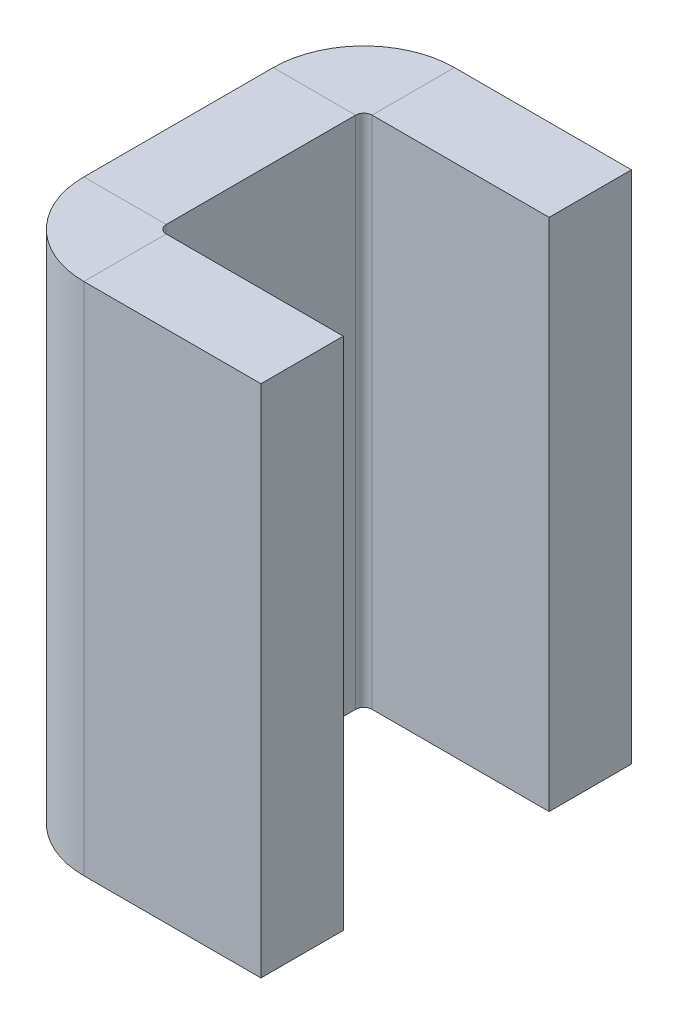
ISO-10303-21;
HEADER;
FILE_DESCRIPTION(('STEP AP214'),'2;1');
FILE_NAME('part.step','',(''),(''),'','','');
FILE_SCHEMA(('AUTOMOTIVE_DESIGN { 1 0 10303 214 1 1 1 1 }'));
ENDSEC;
DATA;
#1=APPLICATION_CONTEXT('core data for automotive mechanical design processes');
#2=APPLICATION_PROTOCOL_DEFINITION('international standard','automotive_design',2000,#1);
#3=PRODUCT_CONTEXT('',#1,'mechanical');
#4=PRODUCT('Part','Part','',(#3));
#5=PRODUCT_RELATED_PRODUCT_CATEGORY('part','',(#4));
#6=PRODUCT_DEFINITION_FORMATION('','',#4);
#7=PRODUCT_DEFINITION_CONTEXT('part definition',#1,'design');
#8=PRODUCT_DEFINITION('design','',#6,#7);
#9=PRODUCT_DEFINITION_SHAPE('','',#8);
#10=(LENGTH_UNIT() NAMED_UNIT(*) SI_UNIT(.MILLI.,.METRE.));
#11=(NAMED_UNIT(*) PLANE_ANGLE_UNIT() SI_UNIT($,.RADIAN.));
#12=(NAMED_UNIT(*) SI_UNIT($,.STERADIAN.) SOLID_ANGLE_UNIT());
#13=UNCERTAINTY_MEASURE_WITH_UNIT(LENGTH_MEASURE(1.E-05),#10,'distance_accuracy_value','');
#14=(GEOMETRIC_REPRESENTATION_CONTEXT(3) GLOBAL_UNCERTAINTY_ASSIGNED_CONTEXT((#13)) GLOBAL_UNIT_ASSIGNED_CONTEXT((#10,
#11,#12)) REPRESENTATION_CONTEXT('',''));
#15=CARTESIAN_POINT('',(0.,0.,0.));
#16=DIRECTION('',(0.,0.,1.));
#17=DIRECTION('',(1.,0.,0.));
#18=AXIS2_PLACEMENT_3D('',#15,#16,#17);
#19=CARTESIAN_POINT('',(38.41388431458,10.585158910602,-1.819325573247));
#20=DIRECTION('',(-1.,8.74227765734797E-08,0.));
#21=DIRECTION('',(0.,0.,1.));
#22=AXIS2_PLACEMENT_3D('',#19,#20,#21);
#23=PLANE('',#22);
#24=DIRECTION('',(-8.74227765734793E-08,-1.,-8.74227339409093E-08));
#25=VECTOR('',#24,1.);
#26=CARTESIAN_POINT('',(38.41388431458,10.585158910602,-1.819325573247));
#27=LINE('',#26,#25);
#28=CARTESIAN_POINT('',(38.413884423858,11.835158910602,-1.819325463969));
#29=VERTEX_POINT('',#28);
#30=CARTESIAN_POINT('',(38.41388431458,10.585158910602,-1.819325573247));
#31=VERTEX_POINT('',#30);
#32=EDGE_CURVE('E296',#29,#31,#27,.T.);
#33=ORIENTED_EDGE('',*,*,#32,.F.);
#34=DIRECTION('',(0.,8.74227339409097E-08,-1.));
#35=VECTOR('',#34,1.);
#36=CARTESIAN_POINT('',(38.413884423858,11.835158910602,-1.819325463969));
#37=LINE('',#36,#35);
#38=CARTESIAN_POINT('',(38.413884423858,11.835158893117,-1.619325463969));
#39=VERTEX_POINT('',#38);
#40=EDGE_CURVE('E11',#39,#29,#37,.T.);
#41=ORIENTED_EDGE('',*,*,#40,.F.);
#42=DIRECTION('',(8.74227765734793E-08,1.,8.74227339409093E-08));
#43=VECTOR('',#42,1.);
#44=CARTESIAN_POINT('',(38.413884423858,11.835158893117,-1.619325463969));
#45=LINE('',#44,#43);
#46=CARTESIAN_POINT('',(38.41388431458,10.585158893117,-1.619325573247));
#47=VERTEX_POINT('',#46);
#48=EDGE_CURVE('E235',#47,#39,#45,.T.);
#49=ORIENTED_EDGE('',*,*,#48,.F.);
#50=DIRECTION('',(0.,-8.74227339409097E-08,1.));
#51=VECTOR('',#50,1.);
#52=CARTESIAN_POINT('',(38.41388431458,10.585158893117,-1.619325573247));
#53=LINE('',#52,#51);
#54=EDGE_CURVE('E190',#31,#47,#53,.T.);
#55=ORIENTED_EDGE('',*,*,#54,.F.);
#56=EDGE_LOOP('',(#33,#41,#49,#55));
#57=FACE_BOUND('',#56,.T.);
#58=ADVANCED_FACE('F16',(#57),#23,.F.);
#59=CARTESIAN_POINT('',(37.983884423858,11.835158948193,-1.819325463969));
#60=DIRECTION('',(-8.74227765734793E-08,-1.,-8.74227339409093E-08));
#61=DIRECTION('',(-1.,8.74227765734797E-08,0.));
#62=AXIS2_PLACEMENT_3D('',#59,#60,#61);
#63=PLANE('',#62);
#64=ORIENTED_EDGE('',*,*,#40,.T.);
#65=DIRECTION('',(1.,-8.74227765734797E-08,0.));
#66=VECTOR('',#65,1.);
#67=CARTESIAN_POINT('',(37.983884423858,11.835158948193,-1.819325463969));
#68=LINE('',#67,#66);
#69=CARTESIAN_POINT('',(37.983884423858,11.835158948193,-1.819325463969));
#70=VERTEX_POINT('',#69);
#71=EDGE_CURVE('E247',#70,#29,#68,.T.);
#72=ORIENTED_EDGE('',*,*,#71,.F.);
#73=DIRECTION('',(0.,8.74227339409097E-08,-1.));
#74=VECTOR('',#73,1.);
#75=CARTESIAN_POINT('',(37.983884423858,11.835158948193,-1.819325463969));
#76=LINE('',#75,#74);
#77=CARTESIAN_POINT('',(37.983884423858,11.835158930709,-1.619325463969));
#78=VERTEX_POINT('',#77);
#79=EDGE_CURVE('E27',#78,#70,#76,.T.);
#80=ORIENTED_EDGE('',*,*,#79,.F.);
#81=DIRECTION('',(1.,-8.74227765734797E-08,0.));
#82=VECTOR('',#81,1.);
#83=CARTESIAN_POINT('',(37.983884423858,11.835158930709,-1.619325463969));
#84=LINE('',#83,#82);
#85=EDGE_CURVE('E254',#78,#39,#84,.T.);
#86=ORIENTED_EDGE('',*,*,#85,.T.);
#87=EDGE_LOOP('',(#64,#72,#80,#86));
#88=FACE_BOUND('',#87,.T.);
#89=ADVANCED_FACE('F18',(#88),#63,.F.);
#90=CARTESIAN_POINT('',(37.899031610116,11.835158949942,-1.754472650227));
#91=DIRECTION('',(8.74227765734793E-08,1.,8.74227339409093E-08));
#92=DIRECTION('',(0.707106608772724,0.,-0.707106953600329));
#93=AXIS2_PLACEMENT_3D('',#90,#91,#92);
#94=PLANE('',#93);
#95=CARTESIAN_POINT('',(37.983884423858,11.835158949942,-1.839325463969));
#96=DIRECTION('',(8.74227765734793E-08,1.,8.74227339409093E-08));
#97=DIRECTION('',(0.,8.74227339409097E-08,-1.));
#98=AXIS2_PLACEMENT_3D('',#95,#96,#97);
#99=CIRCLE('',#98,0.22);
#100=CARTESIAN_POINT('',(37.763884423858,11.835158969175,-1.839325463969));
#101=VERTEX_POINT('',#100);
#102=EDGE_CURVE('E215',#101,#78,#99,.T.);
#103=ORIENTED_EDGE('',*,*,#102,.T.);
#104=ORIENTED_EDGE('',*,*,#79,.T.);
#105=CARTESIAN_POINT('',(37.983884423858,11.835158949942,-1.839325463969));
#106=DIRECTION('',(8.74227765734793E-08,1.,8.74227339409093E-08));
#107=DIRECTION('',(0.,8.74227339409097E-08,-1.));
#108=AXIS2_PLACEMENT_3D('',#105,#106,#107);
#109=CIRCLE('',#108,0.02);
#110=CARTESIAN_POINT('',(37.963884423858,11.83515895169,-1.839325463969));
#111=VERTEX_POINT('',#110);
#112=EDGE_CURVE('E209',#111,#70,#109,.T.);
#113=ORIENTED_EDGE('',*,*,#112,.F.);
#114=DIRECTION('',(1.,-8.74227765734797E-08,0.));
#115=VECTOR('',#114,1.);
#116=CARTESIAN_POINT('',(37.963884423858,11.83515895169,-1.839325463969));
#117=LINE('',#116,#115);
#118=EDGE_CURVE('E126',#101,#111,#117,.T.);
#119=ORIENTED_EDGE('',*,*,#118,.F.);
#120=EDGE_LOOP('',(#103,#104,#113,#119));
#121=FACE_BOUND('',#120,.T.);
#122=ADVANCED_FACE('F452',(#121),#94,.T.);
#123=CARTESIAN_POINT('',(37.963884423858,11.835158991905,-2.299325463969));
#124=DIRECTION('',(-8.74227765734793E-08,-1.,-8.74227339409093E-08));
#125=DIRECTION('',(-1.,8.74227765734797E-08,0.));
#126=AXIS2_PLACEMENT_3D('',#123,#124,#125);
#127=PLANE('',#126);
#128=ORIENTED_EDGE('',*,*,#118,.T.);
#129=DIRECTION('',(0.,-8.74227339409097E-08,1.));
#130=VECTOR('',#129,1.);
#131=CARTESIAN_POINT('',(37.963884423858,11.835158991905,-2.299325463969));
#132=LINE('',#131,#130);
#133=CARTESIAN_POINT('',(37.963884423858,11.835158991905,-2.299325463969));
#134=VERTEX_POINT('',#133);
#135=EDGE_CURVE('E129',#134,#111,#132,.T.);
#136=ORIENTED_EDGE('',*,*,#135,.F.);
#137=DIRECTION('',(1.,-8.74227765734797E-08,0.));
#138=VECTOR('',#137,1.);
#139=CARTESIAN_POINT('',(37.963884423858,11.835158991905,-2.299325463969));
#140=LINE('',#139,#138);
#141=CARTESIAN_POINT('',(37.763884423858,11.835159009389,-2.299325463969));
#142=VERTEX_POINT('',#141);
#143=EDGE_CURVE('E113',#142,#134,#140,.T.);
#144=ORIENTED_EDGE('',*,*,#143,.F.);
#145=DIRECTION('',(0.,-8.74227339409097E-08,1.));
#146=VECTOR('',#145,1.);
#147=CARTESIAN_POINT('',(37.763884423858,11.835159009389,-2.299325463969));
#148=LINE('',#147,#146);
#149=EDGE_CURVE('E180',#142,#101,#148,.T.);
#150=ORIENTED_EDGE('',*,*,#149,.T.);
#151=EDGE_LOOP('',(#128,#136,#144,#150));
#152=FACE_BOUND('',#151,.T.);
#153=ADVANCED_FACE('F130',(#152),#127,.F.);
#154=CARTESIAN_POINT('',(37.899031610116,11.835159004992,-2.384178277711));
#155=DIRECTION('',(8.74227765734793E-08,1.,8.74227339409093E-08));
#156=DIRECTION('',(0.707106608772724,0.,-0.707106953600329));
#157=AXIS2_PLACEMENT_3D('',#154,#155,#156);
#158=PLANE('',#157);
#159=CARTESIAN_POINT('',(37.983884423858,11.835158990156,-2.299325463969));
#160=DIRECTION('',(8.74227765734793E-08,1.,8.74227339409093E-08));
#161=DIRECTION('',(0.,8.74227339409097E-08,-1.));
#162=AXIS2_PLACEMENT_3D('',#159,#160,#161);
#163=CIRCLE('',#162,0.22);
#164=CARTESIAN_POINT('',(37.983884423858,11.835159009389,-2.519325463969));
#165=VERTEX_POINT('',#164);
#166=EDGE_CURVE('E120',#165,#142,#163,.T.);
#167=ORIENTED_EDGE('',*,*,#166,.T.);
#168=ORIENTED_EDGE('',*,*,#143,.T.);
#169=CARTESIAN_POINT('',(37.983884423858,11.835158990156,-2.299325463969));
#170=DIRECTION('',(8.74227765734793E-08,1.,8.74227339409093E-08));
#171=DIRECTION('',(0.,8.74227339409097E-08,-1.));
#172=AXIS2_PLACEMENT_3D('',#169,#170,#171);
#173=CIRCLE('',#172,0.02);
#174=CARTESIAN_POINT('',(37.983884423858,11.835158991905,-2.319325463969));
#175=VERTEX_POINT('',#174);
#176=EDGE_CURVE('E117',#175,#134,#173,.T.);
#177=ORIENTED_EDGE('',*,*,#176,.F.);
#178=DIRECTION('',(0.,-8.74227339409097E-08,1.));
#179=VECTOR('',#178,1.);
#180=CARTESIAN_POINT('',(37.983884423858,11.835158991905,-2.319325463969));
#181=LINE('',#180,#179);
#182=EDGE_CURVE('E20',#165,#175,#181,.T.);
#183=ORIENTED_EDGE('',*,*,#182,.F.);
#184=EDGE_LOOP('',(#167,#168,#177,#183));
#185=FACE_BOUND('',#184,.T.);
#186=ADVANCED_FACE('F115',(#185),#158,.T.);
#187=CARTESIAN_POINT('',(38.413884423858,11.835158954313,-2.319325463969));
#188=DIRECTION('',(-8.74227765734793E-08,-1.,-8.74227339409093E-08));
#189=DIRECTION('',(-1.,8.74227765734797E-08,0.));
#190=AXIS2_PLACEMENT_3D('',#187,#188,#189);
#191=PLANE('',#190);
#192=ORIENTED_EDGE('',*,*,#182,.T.);
#193=DIRECTION('',(-1.,8.74227765734797E-08,0.));
#194=VECTOR('',#193,1.);
#195=CARTESIAN_POINT('',(38.413884423858,11.835158954313,-2.319325463969));
#196=LINE('',#195,#194);
#197=CARTESIAN_POINT('',(38.413884423858,11.835158954313,-2.319325463969));
#198=VERTEX_POINT('',#197);
#199=EDGE_CURVE('E158',#198,#175,#196,.T.);
#200=ORIENTED_EDGE('',*,*,#199,.F.);
#201=DIRECTION('',(0.,-8.74227339409097E-08,1.));
#202=VECTOR('',#201,1.);
#203=CARTESIAN_POINT('',(38.413884423858,11.835158954313,-2.319325463969));
#204=LINE('',#203,#202);
#205=CARTESIAN_POINT('',(38.413884423858,11.835158971797,-2.519325463969));
#206=VERTEX_POINT('',#205);
#207=EDGE_CURVE('E176',#206,#198,#204,.T.);
#208=ORIENTED_EDGE('',*,*,#207,.F.);
#209=DIRECTION('',(-1.,8.74227765734797E-08,0.));
#210=VECTOR('',#209,1.);
#211=CARTESIAN_POINT('',(38.413884423858,11.835158971797,-2.519325463969));
#212=LINE('',#211,#210);
#213=EDGE_CURVE('E246',#206,#165,#212,.T.);
#214=ORIENTED_EDGE('',*,*,#213,.T.);
#215=EDGE_LOOP('',(#192,#200,#208,#214));
#216=FACE_BOUND('',#215,.T.);
#217=ADVANCED_FACE('F280',(#216),#191,.F.);
#218=CARTESIAN_POINT('',(37.983884423858,11.835158930709,-1.619325463969));
#219=DIRECTION('',(0.,8.74227339409097E-08,-1.));
#220=DIRECTION('',(-1.,0.,0.));
#221=AXIS2_PLACEMENT_3D('',#218,#219,#220);
#222=PLANE('',#221);
#223=ORIENTED_EDGE('',*,*,#48,.T.);
#224=ORIENTED_EDGE('',*,*,#85,.F.);
#225=DIRECTION('',(8.74227765734793E-08,1.,8.74227339409093E-08));
#226=VECTOR('',#225,1.);
#227=CARTESIAN_POINT('',(37.983884423858,11.835158930709,-1.619325463969));
#228=LINE('',#227,#226);
#229=CARTESIAN_POINT('',(37.98388431458,10.585158930709,-1.619325573247));
#230=VERTEX_POINT('',#229);
#231=EDGE_CURVE('E212',#230,#78,#228,.T.);
#232=ORIENTED_EDGE('',*,*,#231,.F.);
#233=DIRECTION('',(1.,-8.74227765734797E-08,0.));
#234=VECTOR('',#233,1.);
#235=CARTESIAN_POINT('',(37.98388431458,10.585158930709,-1.619325573247));
#236=LINE('',#235,#234);
#237=EDGE_CURVE('E185',#230,#47,#236,.T.);
#238=ORIENTED_EDGE('',*,*,#237,.T.);
#239=EDGE_LOOP('',(#223,#224,#232,#238));
#240=FACE_BOUND('',#239,.T.);
#241=ADVANCED_FACE('F425',(#240),#222,.F.);
#242=CARTESIAN_POINT('',(37.983884423858,11.835158949942,-1.839325463969));
#243=DIRECTION('',(8.74227765734793E-08,1.,8.74227339409093E-08));
#244=DIRECTION('',(0.,8.74227339409097E-08,-1.));
#245=AXIS2_PLACEMENT_3D('',#242,#243,#244);
#246=CYLINDRICAL_SURFACE('',#245,0.22);
#247=CARTESIAN_POINT('',(37.98388431458,10.585158949942,-1.839325573247));
#248=DIRECTION('',(8.74227765734793E-08,1.,8.74227339409093E-08));
#249=DIRECTION('',(0.,8.74227339409097E-08,-1.));
#250=AXIS2_PLACEMENT_3D('',#247,#248,#249);
#251=CIRCLE('',#250,0.22);
#252=CARTESIAN_POINT('',(37.76388431458,10.585158969175,-1.839325573247));
#253=VERTEX_POINT('',#252);
#254=EDGE_CURVE('E219',#253,#230,#251,.T.);
#255=ORIENTED_EDGE('',*,*,#254,.T.);
#256=ORIENTED_EDGE('',*,*,#231,.T.);
#257=ORIENTED_EDGE('',*,*,#102,.F.);
#258=DIRECTION('',(8.74227765734793E-08,1.,8.74227339409093E-08));
#259=VECTOR('',#258,1.);
#260=CARTESIAN_POINT('',(37.763884423858,11.835158969175,-1.839325463969));
#261=LINE('',#260,#259);
#262=EDGE_CURVE('E177',#253,#101,#261,.T.);
#263=ORIENTED_EDGE('',*,*,#262,.F.);
#264=EDGE_LOOP('',(#255,#256,#257,#263));
#265=FACE_BOUND('',#264,.T.);
#266=ADVANCED_FACE('F466',(#265),#246,.T.);
#267=CARTESIAN_POINT('',(37.763884423858,11.835159009389,-2.299325463969));
#268=DIRECTION('',(1.,-8.74227765734797E-08,0.));
#269=DIRECTION('',(0.,8.74227377816483E-08,-1.));
#270=AXIS2_PLACEMENT_3D('',#267,#268,#269);
#271=PLANE('',#270);
#272=ORIENTED_EDGE('',*,*,#262,.T.);
#273=ORIENTED_EDGE('',*,*,#149,.F.);
#274=DIRECTION('',(8.74227765734793E-08,1.,8.74227339409093E-08));
#275=VECTOR('',#274,1.);
#276=CARTESIAN_POINT('',(37.763884423858,11.835159009389,-2.299325463969));
#277=LINE('',#276,#275);
#278=CARTESIAN_POINT('',(37.76388431458,10.585159009389,-2.299325573247));
#279=VERTEX_POINT('',#278);
#280=EDGE_CURVE('E243',#279,#142,#277,.T.);
#281=ORIENTED_EDGE('',*,*,#280,.F.);
#282=DIRECTION('',(0.,-8.74227339409097E-08,1.));
#283=VECTOR('',#282,1.);
#284=CARTESIAN_POINT('',(37.76388431458,10.585159009389,-2.299325573247));
#285=LINE('',#284,#283);
#286=EDGE_CURVE('E269',#279,#253,#285,.T.);
#287=ORIENTED_EDGE('',*,*,#286,.T.);
#288=EDGE_LOOP('',(#272,#273,#281,#287));
#289=FACE_BOUND('',#288,.T.);
#290=ADVANCED_FACE('F413',(#289),#271,.F.);
#291=CARTESIAN_POINT('',(37.983884423858,11.835158990156,-2.299325463969));
#292=DIRECTION('',(8.74227765734793E-08,1.,8.74227339409093E-08));
#293=DIRECTION('',(0.,8.74227339409097E-08,-1.));
#294=AXIS2_PLACEMENT_3D('',#291,#292,#293);
#295=CYLINDRICAL_SURFACE('',#294,0.22);
#296=CARTESIAN_POINT('',(37.98388431458,10.585158990156,-2.299325573247));
#297=DIRECTION('',(8.74227765734793E-08,1.,8.74227339409093E-08));
#298=DIRECTION('',(0.,8.74227339409097E-08,-1.));
#299=AXIS2_PLACEMENT_3D('',#296,#297,#298);
#300=CIRCLE('',#299,0.22);
#301=CARTESIAN_POINT('',(37.98388431458,10.585159009389,-2.519325573247));
#302=VERTEX_POINT('',#301);
#303=EDGE_CURVE('E203',#302,#279,#300,.T.);
#304=ORIENTED_EDGE('',*,*,#303,.T.);
#305=ORIENTED_EDGE('',*,*,#280,.T.);
#306=ORIENTED_EDGE('',*,*,#166,.F.);
#307=DIRECTION('',(8.74227765734793E-08,1.,8.74227339409093E-08));
#308=VECTOR('',#307,1.);
#309=CARTESIAN_POINT('',(37.983884423858,11.835159009389,-2.519325463969));
#310=LINE('',#309,#308);
#311=EDGE_CURVE('E189',#302,#165,#310,.T.);
#312=ORIENTED_EDGE('',*,*,#311,.F.);
#313=EDGE_LOOP('',(#304,#305,#306,#312));
#314=FACE_BOUND('',#313,.T.);
#315=ADVANCED_FACE('F283',(#314),#295,.T.);
#316=CARTESIAN_POINT('',(38.413884423858,11.835158971797,-2.519325463969));
#317=DIRECTION('',(0.,-8.74227339409097E-08,1.));
#318=DIRECTION('',(-1.,0.,0.));
#319=AXIS2_PLACEMENT_3D('',#316,#317,#318);
#320=PLANE('',#319);
#321=ORIENTED_EDGE('',*,*,#311,.T.);
#322=ORIENTED_EDGE('',*,*,#213,.F.);
#323=DIRECTION('',(8.74227765734793E-08,1.,8.74227339409093E-08));
#324=VECTOR('',#323,1.);
#325=CARTESIAN_POINT('',(38.413884423858,11.835158971797,-2.519325463969));
#326=LINE('',#325,#324);
#327=CARTESIAN_POINT('',(38.41388431458,10.585158971797,-2.519325573247));
#328=VERTEX_POINT('',#327);
#329=EDGE_CURVE('E170',#328,#206,#326,.T.);
#330=ORIENTED_EDGE('',*,*,#329,.F.);
#331=DIRECTION('',(-1.,8.74227765734797E-08,0.));
#332=VECTOR('',#331,1.);
#333=CARTESIAN_POINT('',(38.41388431458,10.585158971797,-2.519325573247));
#334=LINE('',#333,#332);
#335=EDGE_CURVE('E204',#328,#302,#334,.T.);
#336=ORIENTED_EDGE('',*,*,#335,.T.);
#337=EDGE_LOOP('',(#321,#322,#330,#336));
#338=FACE_BOUND('',#337,.T.);
#339=ADVANCED_FACE('F412',(#338),#320,.F.);
#340=CARTESIAN_POINT('',(37.98388431458,10.585158930709,-1.619325573247));
#341=DIRECTION('',(8.74227765734793E-08,1.,8.74227339409093E-08));
#342=DIRECTION('',(0.707106608772724,0.,-0.707106953600329));
#343=AXIS2_PLACEMENT_3D('',#340,#341,#342);
#344=PLANE('',#343);
#345=ORIENTED_EDGE('',*,*,#54,.T.);
#346=ORIENTED_EDGE('',*,*,#237,.F.);
#347=DIRECTION('',(0.,-8.74227339409097E-08,1.));
#348=VECTOR('',#347,1.);
#349=CARTESIAN_POINT('',(37.98388431458,10.585158930709,-1.619325573247));
#350=LINE('',#349,#348);
#351=CARTESIAN_POINT('',(37.98388431458,10.585158948193,-1.819325573247));
#352=VERTEX_POINT('',#351);
#353=EDGE_CURVE('E223',#352,#230,#350,.T.);
#354=ORIENTED_EDGE('',*,*,#353,.F.);
#355=DIRECTION('',(1.,-8.74227765734797E-08,0.));
#356=VECTOR('',#355,1.);
#357=CARTESIAN_POINT('',(37.98388431458,10.585158948193,-1.819325573247));
#358=LINE('',#357,#356);
#359=EDGE_CURVE('E251',#352,#31,#358,.T.);
#360=ORIENTED_EDGE('',*,*,#359,.T.);
#361=EDGE_LOOP('',(#345,#346,#354,#360));
#362=FACE_BOUND('',#361,.T.);
#363=ADVANCED_FACE('F510',(#362),#344,.F.);
#364=CARTESIAN_POINT('',(37.899031500838,10.585158949942,-1.754472759505));
#365=DIRECTION('',(-8.74227765734793E-08,-1.,-8.74227339409093E-08));
#366=DIRECTION('',(-1.,8.74227765734797E-08,0.));
#367=AXIS2_PLACEMENT_3D('',#364,#365,#366);
#368=PLANE('',#367);
#369=CARTESIAN_POINT('',(37.98388431458,10.585158949942,-1.839325573247));
#370=DIRECTION('',(8.74227765734793E-08,1.,8.74227339409093E-08));
#371=DIRECTION('',(0.,8.74227339409097E-08,-1.));
#372=AXIS2_PLACEMENT_3D('',#369,#370,#371);
#373=CIRCLE('',#372,0.02);
#374=CARTESIAN_POINT('',(37.96388431458,10.58515895169,-1.839325573247));
#375=VERTEX_POINT('',#374);
#376=EDGE_CURVE('E205',#375,#352,#373,.T.);
#377=ORIENTED_EDGE('',*,*,#376,.T.);
#378=ORIENTED_EDGE('',*,*,#353,.T.);
#379=ORIENTED_EDGE('',*,*,#254,.F.);
#380=DIRECTION('',(-1.,8.74227765734797E-08,0.));
#381=VECTOR('',#380,1.);
#382=CARTESIAN_POINT('',(37.76388431458,10.585158969175,-1.839325573247));
#383=LINE('',#382,#381);
#384=EDGE_CURVE('E231',#375,#253,#383,.T.);
#385=ORIENTED_EDGE('',*,*,#384,.F.);
#386=EDGE_LOOP('',(#377,#378,#379,#385));
#387=FACE_BOUND('',#386,.T.);
#388=ADVANCED_FACE('F319',(#387),#368,.T.);
#389=CARTESIAN_POINT('',(37.76388431458,10.585159009389,-2.299325573247));
#390=DIRECTION('',(8.74227765734793E-08,1.,8.74227339409093E-08));
#391=DIRECTION('',(0.707106608772724,0.,-0.707106953600329));
#392=AXIS2_PLACEMENT_3D('',#389,#390,#391);
#393=PLANE('',#392);
#394=ORIENTED_EDGE('',*,*,#384,.T.);
#395=ORIENTED_EDGE('',*,*,#286,.F.);
#396=DIRECTION('',(-1.,8.74227765734797E-08,0.));
#397=VECTOR('',#396,1.);
#398=CARTESIAN_POINT('',(37.76388431458,10.585159009389,-2.299325573247));
#399=LINE('',#398,#397);
#400=CARTESIAN_POINT('',(37.96388431458,10.585158991905,-2.299325573247));
#401=VERTEX_POINT('',#400);
#402=EDGE_CURVE('E199',#401,#279,#399,.T.);
#403=ORIENTED_EDGE('',*,*,#402,.F.);
#404=DIRECTION('',(0.,-8.74227339409097E-08,1.));
#405=VECTOR('',#404,1.);
#406=CARTESIAN_POINT('',(37.96388431458,10.585158991905,-2.299325573247));
#407=LINE('',#406,#405);
#408=EDGE_CURVE('E139',#401,#375,#407,.T.);
#409=ORIENTED_EDGE('',*,*,#408,.T.);
#410=EDGE_LOOP('',(#394,#395,#403,#409));
#411=FACE_BOUND('',#410,.T.);
#412=ADVANCED_FACE('F307',(#411),#393,.F.);
#413=CARTESIAN_POINT('',(37.899031500838,10.585159004992,-2.384178386989));
#414=DIRECTION('',(-8.74227765734793E-08,-1.,-8.74227339409093E-08));
#415=DIRECTION('',(-1.,8.74227765734797E-08,0.));
#416=AXIS2_PLACEMENT_3D('',#413,#414,#415);
#417=PLANE('',#416);
#418=CARTESIAN_POINT('',(37.98388431458,10.585158990156,-2.299325573247));
#419=DIRECTION('',(8.74227765734793E-08,1.,8.74227339409093E-08));
#420=DIRECTION('',(0.,8.74227339409097E-08,-1.));
#421=AXIS2_PLACEMENT_3D('',#418,#419,#420);
#422=CIRCLE('',#421,0.02);
#423=CARTESIAN_POINT('',(37.98388431458,10.585158991905,-2.319325573247));
#424=VERTEX_POINT('',#423);
#425=EDGE_CURVE('E151',#424,#401,#422,.T.);
#426=ORIENTED_EDGE('',*,*,#425,.T.);
#427=ORIENTED_EDGE('',*,*,#402,.T.);
#428=ORIENTED_EDGE('',*,*,#303,.F.);
#429=DIRECTION('',(0.,8.74227339409097E-08,-1.));
#430=VECTOR('',#429,1.);
#431=CARTESIAN_POINT('',(37.98388431458,10.585159009389,-2.519325573247));
#432=LINE('',#431,#430);
#433=EDGE_CURVE('E239',#424,#302,#432,.T.);
#434=ORIENTED_EDGE('',*,*,#433,.F.);
#435=EDGE_LOOP('',(#426,#427,#428,#434));
#436=FACE_BOUND('',#435,.T.);
#437=ADVANCED_FACE('F396',(#436),#417,.T.);
#438=CARTESIAN_POINT('',(38.41388431458,10.585158971797,-2.519325573247));
#439=DIRECTION('',(8.74227765734793E-08,1.,8.74227339409093E-08));
#440=DIRECTION('',(0.707106608772724,0.,-0.707106953600329));
#441=AXIS2_PLACEMENT_3D('',#438,#439,#440);
#442=PLANE('',#441);
#443=ORIENTED_EDGE('',*,*,#433,.T.);
#444=ORIENTED_EDGE('',*,*,#335,.F.);
#445=DIRECTION('',(0.,8.74227339409097E-08,-1.));
#446=VECTOR('',#445,1.);
#447=CARTESIAN_POINT('',(38.41388431458,10.585158971797,-2.519325573247));
#448=LINE('',#447,#446);
#449=CARTESIAN_POINT('',(38.41388431458,10.585158954313,-2.319325573247));
#450=VERTEX_POINT('',#449);
#451=EDGE_CURVE('E224',#450,#328,#448,.T.);
#452=ORIENTED_EDGE('',*,*,#451,.F.);
#453=DIRECTION('',(-1.,8.74227765734797E-08,0.));
#454=VECTOR('',#453,1.);
#455=CARTESIAN_POINT('',(38.41388431458,10.585158954313,-2.319325573247));
#456=LINE('',#455,#454);
#457=EDGE_CURVE('E166',#450,#424,#456,.T.);
#458=ORIENTED_EDGE('',*,*,#457,.T.);
#459=EDGE_LOOP('',(#443,#444,#452,#458));
#460=FACE_BOUND('',#459,.T.);
#461=ADVANCED_FACE('F387',(#460),#442,.F.);
#462=CARTESIAN_POINT('',(37.98388431458,10.585158948193,-1.819325573247));
#463=DIRECTION('',(0.,-8.74227339409097E-08,1.));
#464=DIRECTION('',(-1.,0.,0.));
#465=AXIS2_PLACEMENT_3D('',#462,#463,#464);
#466=PLANE('',#465);
#467=ORIENTED_EDGE('',*,*,#32,.T.);
#468=ORIENTED_EDGE('',*,*,#359,.F.);
#469=DIRECTION('',(8.74227765734793E-08,1.,8.74227339409093E-08));
#470=VECTOR('',#469,1.);
#471=CARTESIAN_POINT('',(37.98388431458,10.585158948193,-1.819325573247));
#472=LINE('',#471,#470);
#473=EDGE_CURVE('E138',#352,#70,#472,.T.);
#474=ORIENTED_EDGE('',*,*,#473,.T.);
#475=ORIENTED_EDGE('',*,*,#71,.T.);
#476=EDGE_LOOP('',(#467,#468,#474,#475));
#477=FACE_BOUND('',#476,.T.);
#478=ADVANCED_FACE('F381',(#477),#466,.F.);
#479=CARTESIAN_POINT('',(37.98388431458,10.585158949942,-1.839325573247));
#480=DIRECTION('',(8.74227765734793E-08,1.,8.74227339409093E-08));
#481=DIRECTION('',(0.,8.74227339409097E-08,-1.));
#482=AXIS2_PLACEMENT_3D('',#479,#480,#481);
#483=CYLINDRICAL_SURFACE('',#482,0.02);
#484=ORIENTED_EDGE('',*,*,#473,.F.);
#485=ORIENTED_EDGE('',*,*,#376,.F.);
#486=DIRECTION('',(-8.74227765734793E-08,-1.,-8.74227339409093E-08));
#487=VECTOR('',#486,1.);
#488=CARTESIAN_POINT('',(37.96388431458,10.58515895169,-1.839325573247));
#489=LINE('',#488,#487);
#490=EDGE_CURVE('E150',#111,#375,#489,.T.);
#491=ORIENTED_EDGE('',*,*,#490,.F.);
#492=ORIENTED_EDGE('',*,*,#112,.T.);
#493=EDGE_LOOP('',(#484,#485,#491,#492));
#494=FACE_BOUND('',#493,.T.);
#495=ADVANCED_FACE('F316',(#494),#483,.F.);
#496=CARTESIAN_POINT('',(37.96388431458,10.585158991905,-2.299325573247));
#497=DIRECTION('',(-1.,8.74227765734797E-08,0.));
#498=DIRECTION('',(0.,0.,1.));
#499=AXIS2_PLACEMENT_3D('',#496,#497,#498);
#500=PLANE('',#499);
#501=ORIENTED_EDGE('',*,*,#490,.T.);
#502=ORIENTED_EDGE('',*,*,#408,.F.);
#503=DIRECTION('',(8.74227765734793E-08,1.,8.74227339409093E-08));
#504=VECTOR('',#503,1.);
#505=CARTESIAN_POINT('',(37.96388431458,10.585158991905,-2.299325573247));
#506=LINE('',#505,#504);
#507=EDGE_CURVE('E146',#401,#134,#506,.T.);
#508=ORIENTED_EDGE('',*,*,#507,.T.);
#509=ORIENTED_EDGE('',*,*,#135,.T.);
#510=EDGE_LOOP('',(#501,#502,#508,#509));
#511=FACE_BOUND('',#510,.T.);
#512=ADVANCED_FACE('F154',(#511),#500,.F.);
#513=CARTESIAN_POINT('',(37.98388431458,10.585158990156,-2.299325573247));
#514=DIRECTION('',(8.74227765734793E-08,1.,8.74227339409093E-08));
#515=DIRECTION('',(0.,8.74227339409097E-08,-1.));
#516=AXIS2_PLACEMENT_3D('',#513,#514,#515);
#517=CYLINDRICAL_SURFACE('',#516,0.02);
#518=ORIENTED_EDGE('',*,*,#507,.F.);
#519=ORIENTED_EDGE('',*,*,#425,.F.);
#520=DIRECTION('',(-8.74227765734793E-08,-1.,-8.74227339409093E-08));
#521=VECTOR('',#520,1.);
#522=CARTESIAN_POINT('',(37.98388431458,10.585158991905,-2.319325573247));
#523=LINE('',#522,#521);
#524=EDGE_CURVE('E148',#175,#424,#523,.T.);
#525=ORIENTED_EDGE('',*,*,#524,.F.);
#526=ORIENTED_EDGE('',*,*,#176,.T.);
#527=EDGE_LOOP('',(#518,#519,#525,#526));
#528=FACE_BOUND('',#527,.T.);
#529=ADVANCED_FACE('F144',(#528),#517,.F.);
#530=CARTESIAN_POINT('',(38.41388431458,10.585158954313,-2.319325573247));
#531=DIRECTION('',(0.,8.74227339409097E-08,-1.));
#532=DIRECTION('',(-1.,0.,0.));
#533=AXIS2_PLACEMENT_3D('',#530,#531,#532);
#534=PLANE('',#533);
#535=ORIENTED_EDGE('',*,*,#524,.T.);
#536=ORIENTED_EDGE('',*,*,#457,.F.);
#537=DIRECTION('',(-8.74227765734793E-08,-1.,-8.74227339409093E-08));
#538=VECTOR('',#537,1.);
#539=CARTESIAN_POINT('',(38.41388431458,10.585158954313,-2.319325573247));
#540=LINE('',#539,#538);
#541=EDGE_CURVE('E172',#198,#450,#540,.T.);
#542=ORIENTED_EDGE('',*,*,#541,.F.);
#543=ORIENTED_EDGE('',*,*,#199,.T.);
#544=EDGE_LOOP('',(#535,#536,#542,#543));
#545=FACE_BOUND('',#544,.T.);
#546=ADVANCED_FACE('F489',(#545),#534,.F.);
#547=CARTESIAN_POINT('',(38.41388431458,10.585158954313,-2.319325573247));
#548=DIRECTION('',(1.,-8.74227765734797E-08,0.));
#549=DIRECTION('',(0.,8.74227377816483E-08,-1.));
#550=AXIS2_PLACEMENT_3D('',#547,#548,#549);
#551=PLANE('',#550);
#552=ORIENTED_EDGE('',*,*,#451,.T.);
#553=ORIENTED_EDGE('',*,*,#329,.T.);
#554=ORIENTED_EDGE('',*,*,#207,.T.);
#555=ORIENTED_EDGE('',*,*,#541,.T.);
#556=EDGE_LOOP('',(#552,#553,#554,#555));
#557=FACE_BOUND('',#556,.T.);
#558=ADVANCED_FACE('F484',(#557),#551,.T.);
#559=CLOSED_SHELL('',(#58,#89,#122,#153,#186,#217,#241,#266,#290,#315,#339,#363,#388,#412,#437,
#461,#478,#495,#512,#529,#546,#558));
#560=MANIFOLD_SOLID_BREP('B1',#559);
#561=ADVANCED_BREP_SHAPE_REPRESENTATION('',(#18,#560),#14);
#562=SHAPE_DEFINITION_REPRESENTATION(#9,#561);
ENDSEC;
END-ISO-10303-21;
